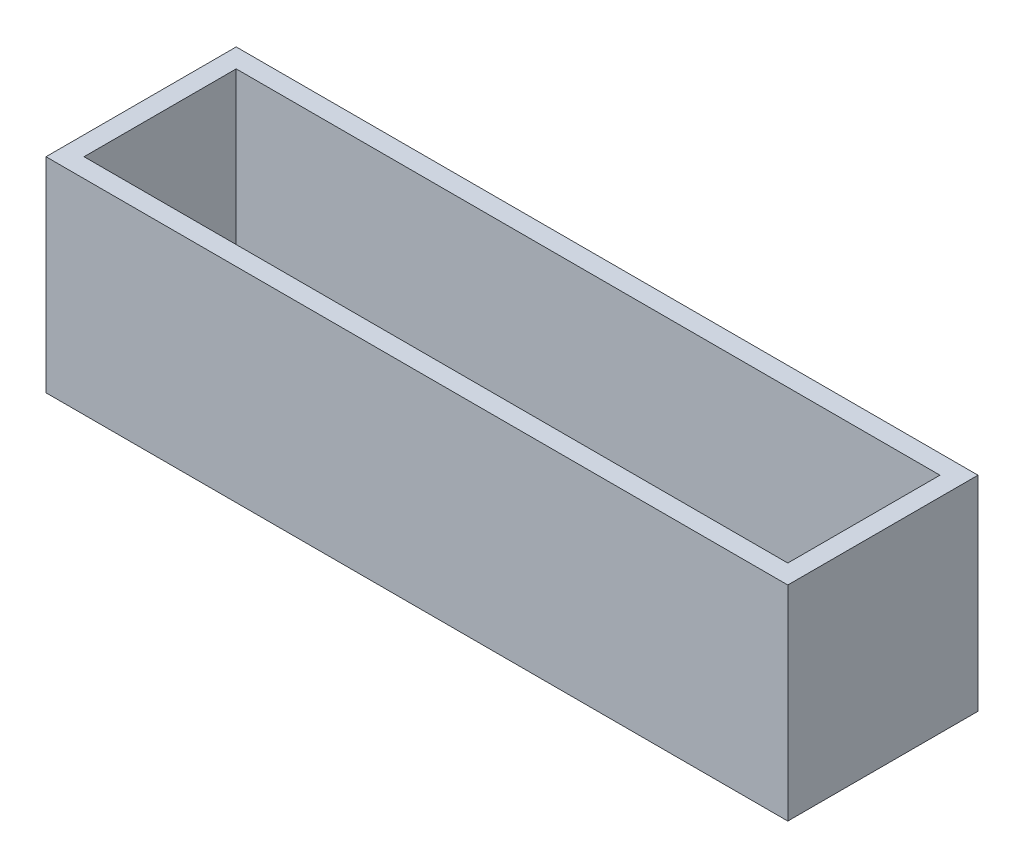
ISO-10303-21;
HEADER;
FILE_DESCRIPTION(('STEP AP214'),'2;1');
FILE_NAME('part.step','',(''),(''),'','','');
FILE_SCHEMA(('AUTOMOTIVE_DESIGN { 1 0 10303 214 1 1 1 1 }'));
ENDSEC;
DATA;
#1=APPLICATION_CONTEXT('core data for automotive mechanical design processes');
#2=APPLICATION_PROTOCOL_DEFINITION('international standard','automotive_design',2000,#1);
#3=PRODUCT_CONTEXT('',#1,'mechanical');
#4=PRODUCT('Part','Part','',(#3));
#5=PRODUCT_RELATED_PRODUCT_CATEGORY('part','',(#4));
#6=PRODUCT_DEFINITION_FORMATION('','',#4);
#7=PRODUCT_DEFINITION_CONTEXT('part definition',#1,'design');
#8=PRODUCT_DEFINITION('design','',#6,#7);
#9=PRODUCT_DEFINITION_SHAPE('','',#8);
#10=(LENGTH_UNIT() NAMED_UNIT(*) SI_UNIT(.MILLI.,.METRE.));
#11=(NAMED_UNIT(*) PLANE_ANGLE_UNIT() SI_UNIT($,.RADIAN.));
#12=(NAMED_UNIT(*) SI_UNIT($,.STERADIAN.) SOLID_ANGLE_UNIT());
#13=UNCERTAINTY_MEASURE_WITH_UNIT(LENGTH_MEASURE(1.E-05),#10,'distance_accuracy_value','');
#14=(GEOMETRIC_REPRESENTATION_CONTEXT(3) GLOBAL_UNCERTAINTY_ASSIGNED_CONTEXT((#13)) GLOBAL_UNIT_ASSIGNED_CONTEXT((#10,
#11,#12)) REPRESENTATION_CONTEXT('',''));
#15=CARTESIAN_POINT('',(0.,0.,0.));
#16=DIRECTION('',(0.,0.,1.));
#17=DIRECTION('',(1.,0.,0.));
#18=AXIS2_PLACEMENT_3D('',#15,#16,#17);
#19=CARTESIAN_POINT('',(39.,21.5,-10.));
#20=DIRECTION('',(-1.,0.,0.));
#21=DIRECTION('',(0.,0.,1.));
#22=AXIS2_PLACEMENT_3D('',#19,#20,#21);
#23=PLANE('',#22);
#24=DIRECTION('',(0.,0.,-1.));
#25=VECTOR('',#24,1.);
#26=CARTESIAN_POINT('',(39.,0.,-10.));
#27=LINE('',#26,#25);
#28=CARTESIAN_POINT('',(39.,0.,10.));
#29=VERTEX_POINT('',#28);
#30=CARTESIAN_POINT('',(39.,0.,-10.));
#31=VERTEX_POINT('',#30);
#32=EDGE_CURVE('E147',#29,#31,#27,.T.);
#33=ORIENTED_EDGE('',*,*,#32,.T.);
#34=DIRECTION('',(0.,-1.,0.));
#35=VECTOR('',#34,1.);
#36=CARTESIAN_POINT('',(39.,21.5,-10.));
#37=LINE('',#36,#35);
#38=CARTESIAN_POINT('',(39.,21.5,-10.));
#39=VERTEX_POINT('',#38);
#40=EDGE_CURVE('E11',#39,#31,#37,.T.);
#41=ORIENTED_EDGE('',*,*,#40,.F.);
#42=DIRECTION('',(0.,0.,-1.));
#43=VECTOR('',#42,1.);
#44=CARTESIAN_POINT('',(39.,21.5,-10.));
#45=LINE('',#44,#43);
#46=CARTESIAN_POINT('',(39.,21.5,10.));
#47=VERTEX_POINT('',#46);
#48=EDGE_CURVE('E140',#47,#39,#45,.T.);
#49=ORIENTED_EDGE('',*,*,#48,.F.);
#50=DIRECTION('',(0.,-1.,0.));
#51=VECTOR('',#50,1.);
#52=CARTESIAN_POINT('',(39.,21.5,10.));
#53=LINE('',#52,#51);
#54=EDGE_CURVE('E146',#47,#29,#53,.T.);
#55=ORIENTED_EDGE('',*,*,#54,.T.);
#56=EDGE_LOOP('',(#33,#41,#49,#55));
#57=FACE_BOUND('',#56,.T.);
#58=ADVANCED_FACE('F33',(#57),#23,.F.);
#59=CARTESIAN_POINT('',(-39.,21.5,-10.));
#60=DIRECTION('',(0.,0.,1.));
#61=DIRECTION('',(1.,0.,0.));
#62=AXIS2_PLACEMENT_3D('',#59,#60,#61);
#63=PLANE('',#62);
#64=DIRECTION('',(-1.,0.,0.));
#65=VECTOR('',#64,1.);
#66=CARTESIAN_POINT('',(-39.,0.,-10.));
#67=LINE('',#66,#65);
#68=CARTESIAN_POINT('',(-39.,0.,-10.));
#69=VERTEX_POINT('',#68);
#70=EDGE_CURVE('E150',#31,#69,#67,.T.);
#71=ORIENTED_EDGE('',*,*,#70,.T.);
#72=DIRECTION('',(0.,-1.,0.));
#73=VECTOR('',#72,1.);
#74=CARTESIAN_POINT('',(-39.,21.5,-10.));
#75=LINE('',#74,#73);
#76=CARTESIAN_POINT('',(-39.,21.5,-10.));
#77=VERTEX_POINT('',#76);
#78=EDGE_CURVE('E40',#77,#69,#75,.T.);
#79=ORIENTED_EDGE('',*,*,#78,.F.);
#80=DIRECTION('',(-1.,0.,0.));
#81=VECTOR('',#80,1.);
#82=CARTESIAN_POINT('',(-39.,21.5,-10.));
#83=LINE('',#82,#81);
#84=EDGE_CURVE('E84',#39,#77,#83,.T.);
#85=ORIENTED_EDGE('',*,*,#84,.F.);
#86=ORIENTED_EDGE('',*,*,#40,.T.);
#87=EDGE_LOOP('',(#71,#79,#85,#86));
#88=FACE_BOUND('',#87,.T.);
#89=ADVANCED_FACE('F179',(#88),#63,.F.);
#90=CARTESIAN_POINT('',(-39.,21.5,-10.));
#91=DIRECTION('',(1.,0.,0.));
#92=DIRECTION('',(0.,0.,-1.));
#93=AXIS2_PLACEMENT_3D('',#90,#91,#92);
#94=PLANE('',#93);
#95=DIRECTION('',(0.,0.,1.));
#96=VECTOR('',#95,1.);
#97=CARTESIAN_POINT('',(-39.,0.,-10.));
#98=LINE('',#97,#96);
#99=CARTESIAN_POINT('',(-39.,0.,10.));
#100=VERTEX_POINT('',#99);
#101=EDGE_CURVE('E152',#69,#100,#98,.T.);
#102=ORIENTED_EDGE('',*,*,#101,.T.);
#103=DIRECTION('',(0.,-1.,0.));
#104=VECTOR('',#103,1.);
#105=CARTESIAN_POINT('',(-39.,21.5,10.));
#106=LINE('',#105,#104);
#107=CARTESIAN_POINT('',(-39.,21.5,10.));
#108=VERTEX_POINT('',#107);
#109=EDGE_CURVE('E156',#108,#100,#106,.T.);
#110=ORIENTED_EDGE('',*,*,#109,.F.);
#111=DIRECTION('',(0.,0.,1.));
#112=VECTOR('',#111,1.);
#113=CARTESIAN_POINT('',(-39.,21.5,-10.));
#114=LINE('',#113,#112);
#115=EDGE_CURVE('E143',#77,#108,#114,.T.);
#116=ORIENTED_EDGE('',*,*,#115,.F.);
#117=ORIENTED_EDGE('',*,*,#78,.T.);
#118=EDGE_LOOP('',(#102,#110,#116,#117));
#119=FACE_BOUND('',#118,.T.);
#120=ADVANCED_FACE('F161',(#119),#94,.F.);
#121=CARTESIAN_POINT('',(-39.,21.5,10.));
#122=DIRECTION('',(0.,0.,-1.));
#123=DIRECTION('',(-1.,0.,0.));
#124=AXIS2_PLACEMENT_3D('',#121,#122,#123);
#125=PLANE('',#124);
#126=DIRECTION('',(1.,0.,0.));
#127=VECTOR('',#126,1.);
#128=CARTESIAN_POINT('',(-39.,0.,10.));
#129=LINE('',#128,#127);
#130=EDGE_CURVE('E77',#100,#29,#129,.T.);
#131=ORIENTED_EDGE('',*,*,#130,.T.);
#132=ORIENTED_EDGE('',*,*,#54,.F.);
#133=DIRECTION('',(1.,0.,0.));
#134=VECTOR('',#133,1.);
#135=CARTESIAN_POINT('',(-39.,21.5,10.));
#136=LINE('',#135,#134);
#137=EDGE_CURVE('E56',#108,#47,#136,.T.);
#138=ORIENTED_EDGE('',*,*,#137,.F.);
#139=ORIENTED_EDGE('',*,*,#109,.T.);
#140=EDGE_LOOP('',(#131,#132,#138,#139));
#141=FACE_BOUND('',#140,.T.);
#142=ADVANCED_FACE('F169',(#141),#125,.F.);
#143=CARTESIAN_POINT('',(0.,21.5,0.));
#144=DIRECTION('',(0.,1.,0.));
#145=DIRECTION('',(0.,0.,1.));
#146=AXIS2_PLACEMENT_3D('',#143,#144,#145);
#147=PLANE('',#146);
#148=DIRECTION('',(0.,0.,-1.));
#149=VECTOR('',#148,1.);
#150=CARTESIAN_POINT('',(37.,21.5,-10.));
#151=LINE('',#150,#149);
#152=CARTESIAN_POINT('',(37.,21.5,8.));
#153=VERTEX_POINT('',#152);
#154=CARTESIAN_POINT('',(37.,21.5,-8.));
#155=VERTEX_POINT('',#154);
#156=EDGE_CURVE('E129',#153,#155,#151,.T.);
#157=ORIENTED_EDGE('',*,*,#156,.F.);
#158=DIRECTION('',(1.,0.,0.));
#159=VECTOR('',#158,1.);
#160=CARTESIAN_POINT('',(-39.,21.5,8.));
#161=LINE('',#160,#159);
#162=CARTESIAN_POINT('',(-37.,21.5,8.));
#163=VERTEX_POINT('',#162);
#164=EDGE_CURVE('E138',#163,#153,#161,.T.);
#165=ORIENTED_EDGE('',*,*,#164,.F.);
#166=DIRECTION('',(0.,0.,1.));
#167=VECTOR('',#166,1.);
#168=CARTESIAN_POINT('',(-37.,21.5,-10.));
#169=LINE('',#168,#167);
#170=CARTESIAN_POINT('',(-37.,21.5,-8.));
#171=VERTEX_POINT('',#170);
#172=EDGE_CURVE('E136',#171,#163,#169,.T.);
#173=ORIENTED_EDGE('',*,*,#172,.F.);
#174=DIRECTION('',(-1.,0.,0.));
#175=VECTOR('',#174,1.);
#176=CARTESIAN_POINT('',(-39.,21.5,-8.));
#177=LINE('',#176,#175);
#178=EDGE_CURVE('E121',#155,#171,#177,.T.);
#179=ORIENTED_EDGE('',*,*,#178,.F.);
#180=EDGE_LOOP('',(#157,#165,#173,#179));
#181=FACE_BOUND('',#180,.T.);
#182=ORIENTED_EDGE('',*,*,#48,.T.);
#183=ORIENTED_EDGE('',*,*,#84,.T.);
#184=ORIENTED_EDGE('',*,*,#115,.T.);
#185=ORIENTED_EDGE('',*,*,#137,.T.);
#186=EDGE_LOOP('',(#182,#183,#184,#185));
#187=FACE_BOUND('',#186,.T.);
#188=ADVANCED_FACE('F171',(#181,#187),#147,.T.);
#189=CARTESIAN_POINT('',(0.,0.,0.));
#190=DIRECTION('',(0.,1.,0.));
#191=DIRECTION('',(0.,0.,1.));
#192=AXIS2_PLACEMENT_3D('',#189,#190,#191);
#193=PLANE('',#192);
#194=ORIENTED_EDGE('',*,*,#32,.F.);
#195=ORIENTED_EDGE('',*,*,#130,.F.);
#196=ORIENTED_EDGE('',*,*,#101,.F.);
#197=ORIENTED_EDGE('',*,*,#70,.F.);
#198=EDGE_LOOP('',(#194,#195,#196,#197));
#199=FACE_BOUND('',#198,.T.);
#200=ADVANCED_FACE('F165',(#199),#193,.F.);
#201=CARTESIAN_POINT('',(37.,21.5,-10.));
#202=DIRECTION('',(-1.,0.,0.));
#203=DIRECTION('',(0.,0.,1.));
#204=AXIS2_PLACEMENT_3D('',#201,#202,#203);
#205=PLANE('',#204);
#206=DIRECTION('',(0.,0.,-1.));
#207=VECTOR('',#206,1.);
#208=CARTESIAN_POINT('',(37.,2.,-10.));
#209=LINE('',#208,#207);
#210=CARTESIAN_POINT('',(37.,2.,8.));
#211=VERTEX_POINT('',#210);
#212=CARTESIAN_POINT('',(37.,2.,-8.));
#213=VERTEX_POINT('',#212);
#214=EDGE_CURVE('E112',#211,#213,#209,.T.);
#215=ORIENTED_EDGE('',*,*,#214,.F.);
#216=DIRECTION('',(0.,-1.,0.));
#217=VECTOR('',#216,1.);
#218=CARTESIAN_POINT('',(37.,21.5,8.));
#219=LINE('',#218,#217);
#220=EDGE_CURVE('E132',#153,#211,#219,.T.);
#221=ORIENTED_EDGE('',*,*,#220,.F.);
#222=ORIENTED_EDGE('',*,*,#156,.T.);
#223=DIRECTION('',(0.,-1.,0.));
#224=VECTOR('',#223,1.);
#225=CARTESIAN_POINT('',(37.,21.5,-8.));
#226=LINE('',#225,#224);
#227=EDGE_CURVE('E124',#155,#213,#226,.T.);
#228=ORIENTED_EDGE('',*,*,#227,.T.);
#229=EDGE_LOOP('',(#215,#221,#222,#228));
#230=FACE_BOUND('',#229,.T.);
#231=ADVANCED_FACE('F206',(#230),#205,.T.);
#232=CARTESIAN_POINT('',(-39.,21.5,-8.));
#233=DIRECTION('',(0.,0.,1.));
#234=DIRECTION('',(1.,0.,0.));
#235=AXIS2_PLACEMENT_3D('',#232,#233,#234);
#236=PLANE('',#235);
#237=DIRECTION('',(-1.,0.,0.));
#238=VECTOR('',#237,1.);
#239=CARTESIAN_POINT('',(-39.,2.,-8.));
#240=LINE('',#239,#238);
#241=CARTESIAN_POINT('',(-37.,2.,-8.));
#242=VERTEX_POINT('',#241);
#243=EDGE_CURVE('E106',#213,#242,#240,.T.);
#244=ORIENTED_EDGE('',*,*,#243,.F.);
#245=ORIENTED_EDGE('',*,*,#227,.F.);
#246=ORIENTED_EDGE('',*,*,#178,.T.);
#247=DIRECTION('',(0.,-1.,0.));
#248=VECTOR('',#247,1.);
#249=CARTESIAN_POINT('',(-37.,21.5,-8.));
#250=LINE('',#249,#248);
#251=EDGE_CURVE('E118',#171,#242,#250,.T.);
#252=ORIENTED_EDGE('',*,*,#251,.T.);
#253=EDGE_LOOP('',(#244,#245,#246,#252));
#254=FACE_BOUND('',#253,.T.);
#255=ADVANCED_FACE('F119',(#254),#236,.T.);
#256=CARTESIAN_POINT('',(-37.,21.5,-10.));
#257=DIRECTION('',(1.,0.,0.));
#258=DIRECTION('',(0.,0.,-1.));
#259=AXIS2_PLACEMENT_3D('',#256,#257,#258);
#260=PLANE('',#259);
#261=DIRECTION('',(0.,0.,1.));
#262=VECTOR('',#261,1.);
#263=CARTESIAN_POINT('',(-37.,2.,-10.));
#264=LINE('',#263,#262);
#265=CARTESIAN_POINT('',(-37.,2.,8.));
#266=VERTEX_POINT('',#265);
#267=EDGE_CURVE('E110',#242,#266,#264,.T.);
#268=ORIENTED_EDGE('',*,*,#267,.F.);
#269=ORIENTED_EDGE('',*,*,#251,.F.);
#270=ORIENTED_EDGE('',*,*,#172,.T.);
#271=DIRECTION('',(0.,-1.,0.));
#272=VECTOR('',#271,1.);
#273=CARTESIAN_POINT('',(-37.,21.5,8.));
#274=LINE('',#273,#272);
#275=EDGE_CURVE('E47',#163,#266,#274,.T.);
#276=ORIENTED_EDGE('',*,*,#275,.T.);
#277=EDGE_LOOP('',(#268,#269,#270,#276));
#278=FACE_BOUND('',#277,.T.);
#279=ADVANCED_FACE('F126',(#278),#260,.T.);
#280=CARTESIAN_POINT('',(-39.,21.5,8.));
#281=DIRECTION('',(0.,0.,-1.));
#282=DIRECTION('',(-1.,0.,0.));
#283=AXIS2_PLACEMENT_3D('',#280,#281,#282);
#284=PLANE('',#283);
#285=DIRECTION('',(1.,0.,0.));
#286=VECTOR('',#285,1.);
#287=CARTESIAN_POINT('',(-39.,2.,8.));
#288=LINE('',#287,#286);
#289=EDGE_CURVE('E127',#266,#211,#288,.T.);
#290=ORIENTED_EDGE('',*,*,#289,.F.);
#291=ORIENTED_EDGE('',*,*,#275,.F.);
#292=ORIENTED_EDGE('',*,*,#164,.T.);
#293=ORIENTED_EDGE('',*,*,#220,.T.);
#294=EDGE_LOOP('',(#290,#291,#292,#293));
#295=FACE_BOUND('',#294,.T.);
#296=ADVANCED_FACE('F236',(#295),#284,.T.);
#297=CARTESIAN_POINT('',(0.,2.,0.));
#298=DIRECTION('',(0.,1.,0.));
#299=DIRECTION('',(0.,0.,1.));
#300=AXIS2_PLACEMENT_3D('',#297,#298,#299);
#301=PLANE('',#300);
#302=ORIENTED_EDGE('',*,*,#214,.T.);
#303=ORIENTED_EDGE('',*,*,#243,.T.);
#304=ORIENTED_EDGE('',*,*,#267,.T.);
#305=ORIENTED_EDGE('',*,*,#289,.T.);
#306=EDGE_LOOP('',(#302,#303,#304,#305));
#307=FACE_BOUND('',#306,.T.);
#308=ADVANCED_FACE('F108',(#307),#301,.T.);
#309=CLOSED_SHELL('',(#58,#89,#120,#142,#188,#200,#231,#255,#279,#296,#308));
#310=MANIFOLD_SOLID_BREP('B2',#309);
#311=ADVANCED_BREP_SHAPE_REPRESENTATION('',(#18,#310),#14);
#312=SHAPE_DEFINITION_REPRESENTATION(#9,#311);
ENDSEC;
END-ISO-10303-21;
